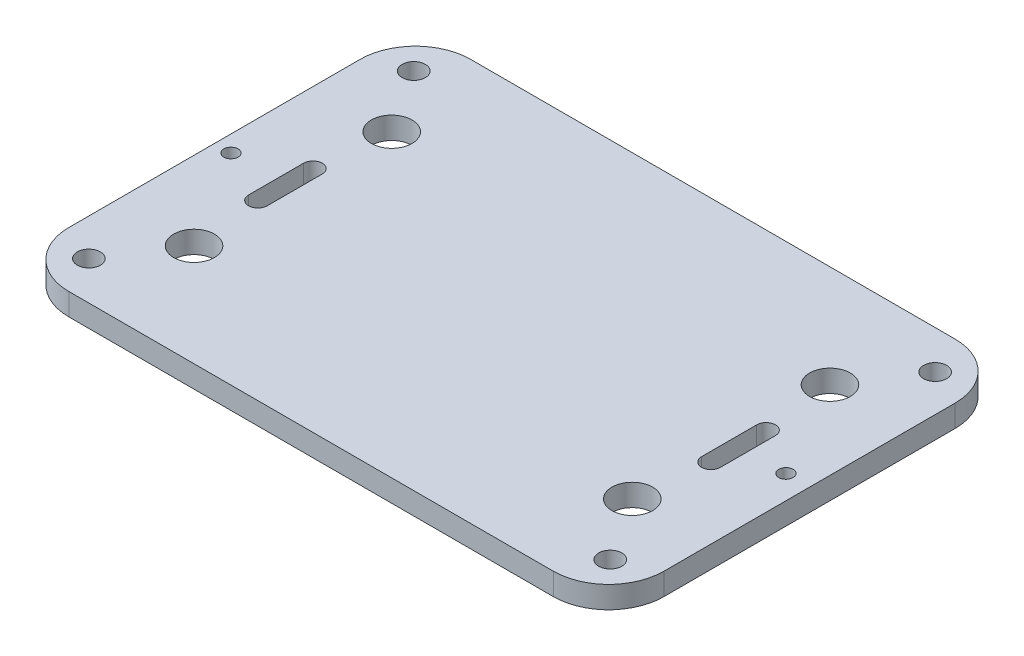
ISO-10303-21;
HEADER;
FILE_DESCRIPTION(('STEP AP214'),'2;1');
FILE_NAME('part.step','',(''),(''),'','','');
FILE_SCHEMA(('AUTOMOTIVE_DESIGN { 1 0 10303 214 1 1 1 1 }'));
ENDSEC;
DATA;
#1=APPLICATION_CONTEXT('core data for automotive mechanical design processes');
#2=APPLICATION_PROTOCOL_DEFINITION('international standard','automotive_design',2000,#1);
#3=PRODUCT_CONTEXT('',#1,'mechanical');
#4=PRODUCT('Part','Part','',(#3));
#5=PRODUCT_RELATED_PRODUCT_CATEGORY('part','',(#4));
#6=PRODUCT_DEFINITION_FORMATION('','',#4);
#7=PRODUCT_DEFINITION_CONTEXT('part definition',#1,'design');
#8=PRODUCT_DEFINITION('design','',#6,#7);
#9=PRODUCT_DEFINITION_SHAPE('','',#8);
#10=(LENGTH_UNIT() NAMED_UNIT(*) SI_UNIT(.MILLI.,.METRE.));
#11=(NAMED_UNIT(*) PLANE_ANGLE_UNIT() SI_UNIT($,.RADIAN.));
#12=(NAMED_UNIT(*) SI_UNIT($,.STERADIAN.) SOLID_ANGLE_UNIT());
#13=UNCERTAINTY_MEASURE_WITH_UNIT(LENGTH_MEASURE(1.E-05),#10,'distance_accuracy_value','');
#14=(GEOMETRIC_REPRESENTATION_CONTEXT(3) GLOBAL_UNCERTAINTY_ASSIGNED_CONTEXT((#13)) GLOBAL_UNIT_ASSIGNED_CONTEXT((#10,
#11,#12)) REPRESENTATION_CONTEXT('',''));
#15=CARTESIAN_POINT('',(0.,0.,0.));
#16=DIRECTION('',(0.,0.,1.));
#17=DIRECTION('',(1.,0.,0.));
#18=AXIS2_PLACEMENT_3D('',#15,#16,#17);
#19=CARTESIAN_POINT('',(-98.05,4.,-10.05));
#20=DIRECTION('',(0.,-1.,0.));
#21=DIRECTION('',(0.,0.,-1.));
#22=AXIS2_PLACEMENT_3D('',#19,#20,#21);
#23=PLANE('',#22);
#24=CARTESIAN_POINT('',(-95.2,4.,-31.5));
#25=DIRECTION('',(0.,1.,0.));
#26=DIRECTION('',(0.,0.,1.));
#27=AXIS2_PLACEMENT_3D('',#24,#25,#26);
#28=CIRCLE('',#27,1.69999999999999);
#29=CARTESIAN_POINT('',(-96.9,4.,-31.5));
#30=VERTEX_POINT('',#29);
#31=CARTESIAN_POINT('',(-93.5,4.,-31.5));
#32=VERTEX_POINT('',#31);
#33=EDGE_CURVE('E208',#30,#32,#28,.T.);
#34=ORIENTED_EDGE('',*,*,#33,.F.);
#35=DIRECTION('',(0.,0.,1.));
#36=VECTOR('',#35,1.);
#37=CARTESIAN_POINT('',(-96.9,4.,-31.5));
#38=LINE('',#37,#36);
#39=CARTESIAN_POINT('',(-96.9,4.,-41.5));
#40=VERTEX_POINT('',#39);
#41=EDGE_CURVE('E219',#40,#30,#38,.T.);
#42=ORIENTED_EDGE('',*,*,#41,.F.);
#43=CARTESIAN_POINT('',(-95.2,4.,-41.5));
#44=DIRECTION('',(0.,1.,0.));
#45=DIRECTION('',(0.,0.,1.));
#46=AXIS2_PLACEMENT_3D('',#43,#44,#45);
#47=CIRCLE('',#46,1.69999999999999);
#48=CARTESIAN_POINT('',(-93.5,4.,-41.5));
#49=VERTEX_POINT('',#48);
#50=EDGE_CURVE('E215',#49,#40,#47,.T.);
#51=ORIENTED_EDGE('',*,*,#50,.F.);
#52=DIRECTION('',(0.,0.,-1.));
#53=VECTOR('',#52,1.);
#54=CARTESIAN_POINT('',(-93.5,4.,-31.5));
#55=LINE('',#54,#53);
#56=EDGE_CURVE('E211',#32,#49,#55,.T.);
#57=ORIENTED_EDGE('',*,*,#56,.F.);
#58=EDGE_LOOP('',(#34,#42,#51,#57));
#59=FACE_BOUND('',#58,.T.);
#60=CARTESIAN_POINT('',(-98.05,4.,-10.05));
#61=DIRECTION('',(0.,1.,0.));
#62=DIRECTION('',(0.,0.,-1.));
#63=AXIS2_PLACEMENT_3D('',#60,#61,#62);
#64=CIRCLE('',#63,10.05);
#65=CARTESIAN_POINT('',(-108.1,4.,-10.0500000000001));
#66=VERTEX_POINT('',#65);
#67=CARTESIAN_POINT('',(-98.0499999999999,4.,0.));
#68=VERTEX_POINT('',#67);
#69=EDGE_CURVE('E315',#66,#68,#64,.T.);
#70=ORIENTED_EDGE('',*,*,#69,.T.);
#71=DIRECTION('',(1.,0.,0.));
#72=VECTOR('',#71,1.);
#73=CARTESIAN_POINT('',(-10.0500000000001,4.,0.));
#74=LINE('',#73,#72);
#75=CARTESIAN_POINT('',(-10.0500000000001,4.,0.));
#76=VERTEX_POINT('',#75);
#77=EDGE_CURVE('E319',#68,#76,#74,.T.);
#78=ORIENTED_EDGE('',*,*,#77,.T.);
#79=CARTESIAN_POINT('',(-10.05,4.,-10.05));
#80=DIRECTION('',(0.,1.,0.));
#81=DIRECTION('',(0.,0.,-1.));
#82=AXIS2_PLACEMENT_3D('',#79,#80,#81);
#83=CIRCLE('',#82,10.05);
#84=CARTESIAN_POINT('',(0.,4.,-10.0500000000001));
#85=VERTEX_POINT('',#84);
#86=EDGE_CURVE('E323',#76,#85,#83,.T.);
#87=ORIENTED_EDGE('',*,*,#86,.T.);
#88=DIRECTION('',(0.,0.,-1.));
#89=VECTOR('',#88,1.);
#90=CARTESIAN_POINT('',(0.,4.,-10.0500000000001));
#91=LINE('',#90,#89);
#92=CARTESIAN_POINT('',(0.,4.,-62.9499999999999));
#93=VERTEX_POINT('',#92);
#94=EDGE_CURVE('E326',#85,#93,#91,.T.);
#95=ORIENTED_EDGE('',*,*,#94,.T.);
#96=CARTESIAN_POINT('',(-10.05,4.,-62.95));
#97=DIRECTION('',(0.,1.,0.));
#98=DIRECTION('',(0.,0.,1.));
#99=AXIS2_PLACEMENT_3D('',#96,#97,#98);
#100=CIRCLE('',#99,10.05);
#101=CARTESIAN_POINT('',(-10.0500000000001,4.,-73.));
#102=VERTEX_POINT('',#101);
#103=EDGE_CURVE('E329',#93,#102,#100,.T.);
#104=ORIENTED_EDGE('',*,*,#103,.T.);
#105=DIRECTION('',(-1.,0.,0.));
#106=VECTOR('',#105,1.);
#107=CARTESIAN_POINT('',(-10.0500000000001,4.,-73.));
#108=LINE('',#107,#106);
#109=CARTESIAN_POINT('',(-98.0499999999999,4.,-73.));
#110=VERTEX_POINT('',#109);
#111=EDGE_CURVE('E332',#102,#110,#108,.T.);
#112=ORIENTED_EDGE('',*,*,#111,.T.);
#113=CARTESIAN_POINT('',(-98.05,4.,-62.95));
#114=DIRECTION('',(0.,1.,0.));
#115=DIRECTION('',(0.,0.,1.));
#116=AXIS2_PLACEMENT_3D('',#113,#114,#115);
#117=CIRCLE('',#116,10.05);
#118=CARTESIAN_POINT('',(-108.1,4.,-62.9499999999999));
#119=VERTEX_POINT('',#118);
#120=EDGE_CURVE('E335',#110,#119,#117,.T.);
#121=ORIENTED_EDGE('',*,*,#120,.T.);
#122=DIRECTION('',(0.,0.,1.));
#123=VECTOR('',#122,1.);
#124=CARTESIAN_POINT('',(-108.1,4.,-10.0500000000001));
#125=LINE('',#124,#123);
#126=EDGE_CURVE('E338',#119,#66,#125,.T.);
#127=ORIENTED_EDGE('',*,*,#126,.T.);
#128=EDGE_LOOP('',(#70,#78,#87,#95,#104,#112,#121,#127));
#129=FACE_BOUND('',#128,.T.);
#130=CARTESIAN_POINT('',(-6.7,4.,-66.));
#131=DIRECTION('',(0.,1.,0.));
#132=DIRECTION('',(0.,0.,1.));
#133=AXIS2_PLACEMENT_3D('',#130,#131,#132);
#134=CIRCLE('',#133,2.1);
#135=CARTESIAN_POINT('',(-6.7,4.,-63.9));
#136=VERTEX_POINT('',#135);
#137=EDGE_CURVE('E307',#136,#136,#134,.T.);
#138=ORIENTED_EDGE('',*,*,#137,.F.);
#139=EDGE_LOOP('',(#138));
#140=FACE_BOUND('',#139,.T.);
#141=CARTESIAN_POINT('',(-6.7,4.,-7.));
#142=DIRECTION('',(0.,1.,0.));
#143=DIRECTION('',(0.,0.,1.));
#144=AXIS2_PLACEMENT_3D('',#141,#142,#143);
#145=CIRCLE('',#144,2.1);
#146=CARTESIAN_POINT('',(-6.7,4.,-4.9));
#147=VERTEX_POINT('',#146);
#148=EDGE_CURVE('E299',#147,#147,#145,.T.);
#149=ORIENTED_EDGE('',*,*,#148,.F.);
#150=EDGE_LOOP('',(#149));
#151=FACE_BOUND('',#150,.T.);
#152=CARTESIAN_POINT('',(-101.4,4.,-66.));
#153=DIRECTION('',(0.,1.,0.));
#154=DIRECTION('',(0.,0.,1.));
#155=AXIS2_PLACEMENT_3D('',#152,#153,#154);
#156=CIRCLE('',#155,2.1);
#157=CARTESIAN_POINT('',(-101.4,4.,-63.9));
#158=VERTEX_POINT('',#157);
#159=EDGE_CURVE('E291',#158,#158,#156,.T.);
#160=ORIENTED_EDGE('',*,*,#159,.F.);
#161=EDGE_LOOP('',(#160));
#162=FACE_BOUND('',#161,.T.);
#163=CARTESIAN_POINT('',(-101.4,4.,-7.));
#164=DIRECTION('',(0.,1.,0.));
#165=DIRECTION('',(0.,0.,1.));
#166=AXIS2_PLACEMENT_3D('',#163,#164,#165);
#167=CIRCLE('',#166,2.1);
#168=CARTESIAN_POINT('',(-101.4,4.,-4.9));
#169=VERTEX_POINT('',#168);
#170=EDGE_CURVE('E283',#169,#169,#167,.T.);
#171=ORIENTED_EDGE('',*,*,#170,.F.);
#172=EDGE_LOOP('',(#171));
#173=FACE_BOUND('',#172,.T.);
#174=CARTESIAN_POINT('',(-93.85,4.,-54.45));
#175=DIRECTION('',(0.,1.,0.));
#176=DIRECTION('',(0.,0.,1.));
#177=AXIS2_PLACEMENT_3D('',#174,#175,#176);
#178=CIRCLE('',#177,3.7);
#179=CARTESIAN_POINT('',(-93.85,4.,-50.75));
#180=VERTEX_POINT('',#179);
#181=EDGE_CURVE('E275',#180,#180,#178,.T.);
#182=ORIENTED_EDGE('',*,*,#181,.F.);
#183=EDGE_LOOP('',(#182));
#184=FACE_BOUND('',#183,.T.);
#185=CARTESIAN_POINT('',(-93.85,4.,-18.55));
#186=DIRECTION('',(0.,1.,0.));
#187=DIRECTION('',(0.,0.,1.));
#188=AXIS2_PLACEMENT_3D('',#185,#186,#187);
#189=CIRCLE('',#188,3.69999999999999);
#190=CARTESIAN_POINT('',(-93.85,4.,-14.85));
#191=VERTEX_POINT('',#190);
#192=EDGE_CURVE('E267',#191,#191,#189,.T.);
#193=ORIENTED_EDGE('',*,*,#192,.F.);
#194=EDGE_LOOP('',(#193));
#195=FACE_BOUND('',#194,.T.);
#196=CARTESIAN_POINT('',(-14.25,4.,-18.55));
#197=DIRECTION('',(0.,1.,0.));
#198=DIRECTION('',(0.,0.,1.));
#199=AXIS2_PLACEMENT_3D('',#196,#197,#198);
#200=CIRCLE('',#199,3.7);
#201=CARTESIAN_POINT('',(-14.25,4.,-14.85));
#202=VERTEX_POINT('',#201);
#203=EDGE_CURVE('E259',#202,#202,#200,.T.);
#204=ORIENTED_EDGE('',*,*,#203,.F.);
#205=EDGE_LOOP('',(#204));
#206=FACE_BOUND('',#205,.T.);
#207=CARTESIAN_POINT('',(-14.25,4.,-54.45));
#208=DIRECTION('',(0.,1.,0.));
#209=DIRECTION('',(0.,0.,1.));
#210=AXIS2_PLACEMENT_3D('',#207,#208,#209);
#211=CIRCLE('',#210,3.7);
#212=CARTESIAN_POINT('',(-14.25,4.,-50.75));
#213=VERTEX_POINT('',#212);
#214=EDGE_CURVE('E251',#213,#213,#211,.T.);
#215=ORIENTED_EDGE('',*,*,#214,.F.);
#216=EDGE_LOOP('',(#215));
#217=FACE_BOUND('',#216,.T.);
#218=CARTESIAN_POINT('',(-12.9,4.,-31.5));
#219=DIRECTION('',(0.,1.,0.));
#220=DIRECTION('',(0.,0.,1.));
#221=AXIS2_PLACEMENT_3D('',#218,#219,#220);
#222=CIRCLE('',#221,1.70000000000001);
#223=CARTESIAN_POINT('',(-14.6,4.,-31.5));
#224=VERTEX_POINT('',#223);
#225=CARTESIAN_POINT('',(-11.2,4.,-31.5));
#226=VERTEX_POINT('',#225);
#227=EDGE_CURVE('E157',#224,#226,#222,.T.);
#228=ORIENTED_EDGE('',*,*,#227,.F.);
#229=DIRECTION('',(0.,0.,1.));
#230=VECTOR('',#229,1.);
#231=CARTESIAN_POINT('',(-14.6,4.,-31.5));
#232=LINE('',#231,#230);
#233=CARTESIAN_POINT('',(-14.6,4.,-41.5));
#234=VERTEX_POINT('',#233);
#235=EDGE_CURVE('E184',#234,#224,#232,.T.);
#236=ORIENTED_EDGE('',*,*,#235,.F.);
#237=CARTESIAN_POINT('',(-12.9,4.,-41.5));
#238=DIRECTION('',(0.,1.,0.));
#239=DIRECTION('',(0.,0.,1.));
#240=AXIS2_PLACEMENT_3D('',#237,#238,#239);
#241=CIRCLE('',#240,1.70000000000001);
#242=CARTESIAN_POINT('',(-11.2,4.,-41.5));
#243=VERTEX_POINT('',#242);
#244=EDGE_CURVE('E180',#243,#234,#241,.T.);
#245=ORIENTED_EDGE('',*,*,#244,.F.);
#246=DIRECTION('',(0.,0.,-1.));
#247=VECTOR('',#246,1.);
#248=CARTESIAN_POINT('',(-11.2,4.,-31.5));
#249=LINE('',#248,#247);
#250=EDGE_CURVE('E166',#226,#243,#249,.T.);
#251=ORIENTED_EDGE('',*,*,#250,.F.);
#252=EDGE_LOOP('',(#228,#236,#245,#251));
#253=FACE_BOUND('',#252,.T.);
#254=CARTESIAN_POINT('',(-4.3,4.,-36.5));
#255=DIRECTION('',(0.,1.,0.));
#256=DIRECTION('',(0.,0.,1.));
#257=AXIS2_PLACEMENT_3D('',#254,#255,#256);
#258=CIRCLE('',#257,1.3);
#259=CARTESIAN_POINT('',(-4.3,4.,-35.2));
#260=VERTEX_POINT('',#259);
#261=EDGE_CURVE('E192',#260,#260,#258,.T.);
#262=ORIENTED_EDGE('',*,*,#261,.F.);
#263=EDGE_LOOP('',(#262));
#264=FACE_BOUND('',#263,.T.);
#265=CARTESIAN_POINT('',(-105.1,4.,-36.5));
#266=DIRECTION('',(0.,1.,0.));
#267=DIRECTION('',(0.,0.,1.));
#268=AXIS2_PLACEMENT_3D('',#265,#266,#267);
#269=CIRCLE('',#268,1.29999999999999);
#270=CARTESIAN_POINT('',(-105.1,4.,-35.2));
#271=VERTEX_POINT('',#270);
#272=EDGE_CURVE('E499',#271,#271,#269,.T.);
#273=ORIENTED_EDGE('',*,*,#272,.F.);
#274=EDGE_LOOP('',(#273));
#275=FACE_BOUND('',#274,.T.);
#276=ADVANCED_FACE('F43',(#59,#129,#140,#151,#162,#173,#184,#195,#206,#217,#253,#264,#275),#23,.F.);
#277=CARTESIAN_POINT('',(-98.05,0.,-10.05));
#278=DIRECTION('',(0.,-1.,0.));
#279=DIRECTION('',(0.,0.,-1.));
#280=AXIS2_PLACEMENT_3D('',#277,#278,#279);
#281=PLANE('',#280);
#282=CARTESIAN_POINT('',(-4.3,0.,-36.5));
#283=DIRECTION('',(0.,1.,0.));
#284=DIRECTION('',(0.,0.,1.));
#285=AXIS2_PLACEMENT_3D('',#282,#283,#284);
#286=CIRCLE('',#285,1.3);
#287=CARTESIAN_POINT('',(-4.3,0.,-35.2));
#288=VERTEX_POINT('',#287);
#289=EDGE_CURVE('E503',#288,#288,#286,.T.);
#290=ORIENTED_EDGE('',*,*,#289,.T.);
#291=EDGE_LOOP('',(#290));
#292=FACE_BOUND('',#291,.T.);
#293=CARTESIAN_POINT('',(-14.25,0.,-18.55));
#294=DIRECTION('',(0.,1.,0.));
#295=DIRECTION('',(0.,0.,1.));
#296=AXIS2_PLACEMENT_3D('',#293,#294,#295);
#297=CIRCLE('',#296,3.7);
#298=CARTESIAN_POINT('',(-14.25,0.,-14.85));
#299=VERTEX_POINT('',#298);
#300=EDGE_CURVE('E255',#299,#299,#297,.T.);
#301=ORIENTED_EDGE('',*,*,#300,.T.);
#302=EDGE_LOOP('',(#301));
#303=FACE_BOUND('',#302,.T.);
#304=CARTESIAN_POINT('',(-93.85,0.,-54.45));
#305=DIRECTION('',(0.,1.,0.));
#306=DIRECTION('',(0.,0.,1.));
#307=AXIS2_PLACEMENT_3D('',#304,#305,#306);
#308=CIRCLE('',#307,3.7);
#309=CARTESIAN_POINT('',(-93.85,0.,-50.75));
#310=VERTEX_POINT('',#309);
#311=EDGE_CURVE('E271',#310,#310,#308,.T.);
#312=ORIENTED_EDGE('',*,*,#311,.T.);
#313=EDGE_LOOP('',(#312));
#314=FACE_BOUND('',#313,.T.);
#315=CARTESIAN_POINT('',(-101.4,0.,-66.));
#316=DIRECTION('',(0.,1.,0.));
#317=DIRECTION('',(0.,0.,1.));
#318=AXIS2_PLACEMENT_3D('',#315,#316,#317);
#319=CIRCLE('',#318,2.1);
#320=CARTESIAN_POINT('',(-101.4,0.,-63.9));
#321=VERTEX_POINT('',#320);
#322=EDGE_CURVE('E287',#321,#321,#319,.T.);
#323=ORIENTED_EDGE('',*,*,#322,.T.);
#324=EDGE_LOOP('',(#323));
#325=FACE_BOUND('',#324,.T.);
#326=CARTESIAN_POINT('',(-6.7,0.,-66.));
#327=DIRECTION('',(0.,1.,0.));
#328=DIRECTION('',(0.,0.,1.));
#329=AXIS2_PLACEMENT_3D('',#326,#327,#328);
#330=CIRCLE('',#329,2.1);
#331=CARTESIAN_POINT('',(-6.7,0.,-63.9));
#332=VERTEX_POINT('',#331);
#333=EDGE_CURVE('E303',#332,#332,#330,.T.);
#334=ORIENTED_EDGE('',*,*,#333,.T.);
#335=EDGE_LOOP('',(#334));
#336=FACE_BOUND('',#335,.T.);
#337=CARTESIAN_POINT('',(-98.05,0.,-10.05));
#338=DIRECTION('',(0.,1.,0.));
#339=DIRECTION('',(0.,0.,-1.));
#340=AXIS2_PLACEMENT_3D('',#337,#338,#339);
#341=CIRCLE('',#340,10.05);
#342=CARTESIAN_POINT('',(-108.1,0.,-10.0500000000001));
#343=VERTEX_POINT('',#342);
#344=CARTESIAN_POINT('',(-98.0499999999999,0.,0.));
#345=VERTEX_POINT('',#344);
#346=EDGE_CURVE('E311',#343,#345,#341,.T.);
#347=ORIENTED_EDGE('',*,*,#346,.F.);
#348=DIRECTION('',(0.,0.,1.));
#349=VECTOR('',#348,1.);
#350=CARTESIAN_POINT('',(-108.1,0.,-10.0500000000001));
#351=LINE('',#350,#349);
#352=CARTESIAN_POINT('',(-108.1,0.,-62.9499999999999));
#353=VERTEX_POINT('',#352);
#354=EDGE_CURVE('E320',#353,#343,#351,.T.);
#355=ORIENTED_EDGE('',*,*,#354,.F.);
#356=CARTESIAN_POINT('',(-98.05,0.,-62.95));
#357=DIRECTION('',(0.,1.,0.));
#358=DIRECTION('',(0.,0.,1.));
#359=AXIS2_PLACEMENT_3D('',#356,#357,#358);
#360=CIRCLE('',#359,10.05);
#361=CARTESIAN_POINT('',(-98.0499999999999,0.,-73.));
#362=VERTEX_POINT('',#361);
#363=EDGE_CURVE('E360',#362,#353,#360,.T.);
#364=ORIENTED_EDGE('',*,*,#363,.F.);
#365=DIRECTION('',(-1.,0.,0.));
#366=VECTOR('',#365,1.);
#367=CARTESIAN_POINT('',(-10.0500000000001,0.,-73.));
#368=LINE('',#367,#366);
#369=CARTESIAN_POINT('',(-10.0500000000001,0.,-73.));
#370=VERTEX_POINT('',#369);
#371=EDGE_CURVE('E357',#370,#362,#368,.T.);
#372=ORIENTED_EDGE('',*,*,#371,.F.);
#373=CARTESIAN_POINT('',(-10.05,0.,-62.95));
#374=DIRECTION('',(0.,1.,0.));
#375=DIRECTION('',(0.,0.,1.));
#376=AXIS2_PLACEMENT_3D('',#373,#374,#375);
#377=CIRCLE('',#376,10.05);
#378=CARTESIAN_POINT('',(0.,0.,-62.9499999999999));
#379=VERTEX_POINT('',#378);
#380=EDGE_CURVE('E354',#379,#370,#377,.T.);
#381=ORIENTED_EDGE('',*,*,#380,.F.);
#382=DIRECTION('',(0.,0.,-1.));
#383=VECTOR('',#382,1.);
#384=CARTESIAN_POINT('',(0.,0.,-10.0500000000001));
#385=LINE('',#384,#383);
#386=CARTESIAN_POINT('',(0.,0.,-10.0500000000001));
#387=VERTEX_POINT('',#386);
#388=EDGE_CURVE('E351',#387,#379,#385,.T.);
#389=ORIENTED_EDGE('',*,*,#388,.F.);
#390=CARTESIAN_POINT('',(-10.05,0.,-10.05));
#391=DIRECTION('',(0.,1.,0.));
#392=DIRECTION('',(0.,0.,-1.));
#393=AXIS2_PLACEMENT_3D('',#390,#391,#392);
#394=CIRCLE('',#393,10.05);
#395=CARTESIAN_POINT('',(-10.0500000000001,0.,0.));
#396=VERTEX_POINT('',#395);
#397=EDGE_CURVE('E348',#396,#387,#394,.T.);
#398=ORIENTED_EDGE('',*,*,#397,.F.);
#399=DIRECTION('',(1.,0.,0.));
#400=VECTOR('',#399,1.);
#401=CARTESIAN_POINT('',(-10.0500000000001,0.,0.));
#402=LINE('',#401,#400);
#403=EDGE_CURVE('E345',#345,#396,#402,.T.);
#404=ORIENTED_EDGE('',*,*,#403,.F.);
#405=EDGE_LOOP('',(#347,#355,#364,#372,#381,#389,#398,#404));
#406=FACE_BOUND('',#405,.T.);
#407=CARTESIAN_POINT('',(-6.7,0.,-7.));
#408=DIRECTION('',(0.,1.,0.));
#409=DIRECTION('',(0.,0.,1.));
#410=AXIS2_PLACEMENT_3D('',#407,#408,#409);
#411=CIRCLE('',#410,2.1);
#412=CARTESIAN_POINT('',(-6.7,0.,-4.9));
#413=VERTEX_POINT('',#412);
#414=EDGE_CURVE('E295',#413,#413,#411,.T.);
#415=ORIENTED_EDGE('',*,*,#414,.T.);
#416=EDGE_LOOP('',(#415));
#417=FACE_BOUND('',#416,.T.);
#418=CARTESIAN_POINT('',(-101.4,0.,-7.));
#419=DIRECTION('',(0.,1.,0.));
#420=DIRECTION('',(0.,0.,1.));
#421=AXIS2_PLACEMENT_3D('',#418,#419,#420);
#422=CIRCLE('',#421,2.1);
#423=CARTESIAN_POINT('',(-101.4,0.,-4.9));
#424=VERTEX_POINT('',#423);
#425=EDGE_CURVE('E279',#424,#424,#422,.T.);
#426=ORIENTED_EDGE('',*,*,#425,.T.);
#427=EDGE_LOOP('',(#426));
#428=FACE_BOUND('',#427,.T.);
#429=CARTESIAN_POINT('',(-93.85,0.,-18.55));
#430=DIRECTION('',(0.,1.,0.));
#431=DIRECTION('',(0.,0.,1.));
#432=AXIS2_PLACEMENT_3D('',#429,#430,#431);
#433=CIRCLE('',#432,3.69999999999999);
#434=CARTESIAN_POINT('',(-93.85,0.,-14.85));
#435=VERTEX_POINT('',#434);
#436=EDGE_CURVE('E263',#435,#435,#433,.T.);
#437=ORIENTED_EDGE('',*,*,#436,.T.);
#438=EDGE_LOOP('',(#437));
#439=FACE_BOUND('',#438,.T.);
#440=CARTESIAN_POINT('',(-14.25,0.,-54.45));
#441=DIRECTION('',(0.,1.,0.));
#442=DIRECTION('',(0.,0.,1.));
#443=AXIS2_PLACEMENT_3D('',#440,#441,#442);
#444=CIRCLE('',#443,3.7);
#445=CARTESIAN_POINT('',(-14.25,0.,-50.75));
#446=VERTEX_POINT('',#445);
#447=EDGE_CURVE('E250',#446,#446,#444,.T.);
#448=ORIENTED_EDGE('',*,*,#447,.T.);
#449=EDGE_LOOP('',(#448));
#450=FACE_BOUND('',#449,.T.);
#451=DIRECTION('',(0.,0.,1.));
#452=VECTOR('',#451,1.);
#453=CARTESIAN_POINT('',(-96.9,0.,-31.5));
#454=LINE('',#453,#452);
#455=CARTESIAN_POINT('',(-96.9,0.,-41.5));
#456=VERTEX_POINT('',#455);
#457=CARTESIAN_POINT('',(-96.9,0.,-31.5));
#458=VERTEX_POINT('',#457);
#459=EDGE_CURVE('E212',#456,#458,#454,.T.);
#460=ORIENTED_EDGE('',*,*,#459,.T.);
#461=CARTESIAN_POINT('',(-95.2,0.,-31.5));
#462=DIRECTION('',(0.,1.,0.));
#463=DIRECTION('',(0.,0.,1.));
#464=AXIS2_PLACEMENT_3D('',#461,#462,#463);
#465=CIRCLE('',#464,1.69999999999999);
#466=CARTESIAN_POINT('',(-93.5,0.,-31.5));
#467=VERTEX_POINT('',#466);
#468=EDGE_CURVE('E175',#458,#467,#465,.T.);
#469=ORIENTED_EDGE('',*,*,#468,.T.);
#470=DIRECTION('',(0.,0.,-1.));
#471=VECTOR('',#470,1.);
#472=CARTESIAN_POINT('',(-93.5,0.,-31.5));
#473=LINE('',#472,#471);
#474=CARTESIAN_POINT('',(-93.5,0.,-41.5));
#475=VERTEX_POINT('',#474);
#476=EDGE_CURVE('E226',#467,#475,#473,.T.);
#477=ORIENTED_EDGE('',*,*,#476,.T.);
#478=CARTESIAN_POINT('',(-95.2,0.,-41.5));
#479=DIRECTION('',(0.,1.,0.));
#480=DIRECTION('',(0.,0.,1.));
#481=AXIS2_PLACEMENT_3D('',#478,#479,#480);
#482=CIRCLE('',#481,1.69999999999999);
#483=EDGE_CURVE('E230',#475,#456,#482,.T.);
#484=ORIENTED_EDGE('',*,*,#483,.T.);
#485=EDGE_LOOP('',(#460,#469,#477,#484));
#486=FACE_BOUND('',#485,.T.);
#487=DIRECTION('',(0.,0.,1.));
#488=VECTOR('',#487,1.);
#489=CARTESIAN_POINT('',(-14.6,0.,-31.5));
#490=LINE('',#489,#488);
#491=CARTESIAN_POINT('',(-14.6,0.,-41.5));
#492=VERTEX_POINT('',#491);
#493=CARTESIAN_POINT('',(-14.6,0.,-31.5));
#494=VERTEX_POINT('',#493);
#495=EDGE_CURVE('E167',#492,#494,#490,.T.);
#496=ORIENTED_EDGE('',*,*,#495,.T.);
#497=CARTESIAN_POINT('',(-12.9,0.,-31.5));
#498=DIRECTION('',(0.,1.,0.));
#499=DIRECTION('',(0.,0.,1.));
#500=AXIS2_PLACEMENT_3D('',#497,#498,#499);
#501=CIRCLE('',#500,1.70000000000001);
#502=CARTESIAN_POINT('',(-11.2,0.,-31.5));
#503=VERTEX_POINT('',#502);
#504=EDGE_CURVE('E67',#494,#503,#501,.T.);
#505=ORIENTED_EDGE('',*,*,#504,.T.);
#506=DIRECTION('',(0.,0.,-1.));
#507=VECTOR('',#506,1.);
#508=CARTESIAN_POINT('',(-11.2,0.,-31.5));
#509=LINE('',#508,#507);
#510=CARTESIAN_POINT('',(-11.2,0.,-41.5));
#511=VERTEX_POINT('',#510);
#512=EDGE_CURVE('E173',#503,#511,#509,.T.);
#513=ORIENTED_EDGE('',*,*,#512,.T.);
#514=CARTESIAN_POINT('',(-12.9,0.,-41.5));
#515=DIRECTION('',(0.,1.,0.));
#516=DIRECTION('',(0.,0.,1.));
#517=AXIS2_PLACEMENT_3D('',#514,#515,#516);
#518=CIRCLE('',#517,1.70000000000001);
#519=EDGE_CURVE('E195',#511,#492,#518,.T.);
#520=ORIENTED_EDGE('',*,*,#519,.T.);
#521=EDGE_LOOP('',(#496,#505,#513,#520));
#522=FACE_BOUND('',#521,.T.);
#523=CARTESIAN_POINT('',(-105.1,0.,-36.5));
#524=DIRECTION('',(0.,1.,0.));
#525=DIRECTION('',(0.,0.,1.));
#526=AXIS2_PLACEMENT_3D('',#523,#524,#525);
#527=CIRCLE('',#526,1.29999999999999);
#528=CARTESIAN_POINT('',(-105.1,0.,-35.2));
#529=VERTEX_POINT('',#528);
#530=EDGE_CURVE('E496',#529,#529,#527,.T.);
#531=ORIENTED_EDGE('',*,*,#530,.T.);
#532=EDGE_LOOP('',(#531));
#533=FACE_BOUND('',#532,.T.);
#534=ADVANCED_FACE('F399',(#292,#303,#314,#325,#336,#406,#417,#428,#439,#450,#486,#522,#533),
#281,.T.);
#535=CARTESIAN_POINT('',(-98.05,4.,-10.05));
#536=DIRECTION('',(0.,-1.,0.));
#537=DIRECTION('',(0.,0.,-1.));
#538=AXIS2_PLACEMENT_3D('',#535,#536,#537);
#539=CYLINDRICAL_SURFACE('',#538,10.05);
#540=ORIENTED_EDGE('',*,*,#346,.T.);
#541=DIRECTION('',(0.,-1.,0.));
#542=VECTOR('',#541,1.);
#543=CARTESIAN_POINT('',(-98.0499999999999,4.,0.));
#544=LINE('',#543,#542);
#545=EDGE_CURVE('E11',#68,#345,#544,.T.);
#546=ORIENTED_EDGE('',*,*,#545,.F.);
#547=ORIENTED_EDGE('',*,*,#69,.F.);
#548=DIRECTION('',(0.,-1.,0.));
#549=VECTOR('',#548,1.);
#550=CARTESIAN_POINT('',(-108.1,4.,-10.0500000000001));
#551=LINE('',#550,#549);
#552=EDGE_CURVE('E341',#66,#343,#551,.T.);
#553=ORIENTED_EDGE('',*,*,#552,.T.);
#554=EDGE_LOOP('',(#540,#546,#547,#553));
#555=FACE_BOUND('',#554,.T.);
#556=ADVANCED_FACE('F45',(#555),#539,.T.);
#557=CARTESIAN_POINT('',(-10.0500000000001,4.,0.));
#558=DIRECTION('',(0.,0.,-1.));
#559=DIRECTION('',(-1.,0.,0.));
#560=AXIS2_PLACEMENT_3D('',#557,#558,#559);
#561=PLANE('',#560);
#562=ORIENTED_EDGE('',*,*,#403,.T.);
#563=DIRECTION('',(0.,-1.,0.));
#564=VECTOR('',#563,1.);
#565=CARTESIAN_POINT('',(-10.0500000000001,4.,0.));
#566=LINE('',#565,#564);
#567=EDGE_CURVE('E52',#76,#396,#566,.T.);
#568=ORIENTED_EDGE('',*,*,#567,.F.);
#569=ORIENTED_EDGE('',*,*,#77,.F.);
#570=ORIENTED_EDGE('',*,*,#545,.T.);
#571=EDGE_LOOP('',(#562,#568,#569,#570));
#572=FACE_BOUND('',#571,.T.);
#573=ADVANCED_FACE('F417',(#572),#561,.F.);
#574=CARTESIAN_POINT('',(-10.05,4.,-10.05));
#575=DIRECTION('',(0.,-1.,0.));
#576=DIRECTION('',(0.,0.,-1.));
#577=AXIS2_PLACEMENT_3D('',#574,#575,#576);
#578=CYLINDRICAL_SURFACE('',#577,10.05);
#579=ORIENTED_EDGE('',*,*,#397,.T.);
#580=DIRECTION('',(0.,-1.,0.));
#581=VECTOR('',#580,1.);
#582=CARTESIAN_POINT('',(0.,4.,-10.0500000000001));
#583=LINE('',#582,#581);
#584=EDGE_CURVE('E384',#85,#387,#583,.T.);
#585=ORIENTED_EDGE('',*,*,#584,.F.);
#586=ORIENTED_EDGE('',*,*,#86,.F.);
#587=ORIENTED_EDGE('',*,*,#567,.T.);
#588=EDGE_LOOP('',(#579,#585,#586,#587));
#589=FACE_BOUND('',#588,.T.);
#590=ADVANCED_FACE('F393',(#589),#578,.T.);
#591=CARTESIAN_POINT('',(0.,4.,-10.0500000000001));
#592=DIRECTION('',(-1.,0.,0.));
#593=DIRECTION('',(0.,0.,1.));
#594=AXIS2_PLACEMENT_3D('',#591,#592,#593);
#595=PLANE('',#594);
#596=ORIENTED_EDGE('',*,*,#388,.T.);
#597=DIRECTION('',(0.,-1.,0.));
#598=VECTOR('',#597,1.);
#599=CARTESIAN_POINT('',(0.,4.,-62.9499999999999));
#600=LINE('',#599,#598);
#601=EDGE_CURVE('E380',#93,#379,#600,.T.);
#602=ORIENTED_EDGE('',*,*,#601,.F.);
#603=ORIENTED_EDGE('',*,*,#94,.F.);
#604=ORIENTED_EDGE('',*,*,#584,.T.);
#605=EDGE_LOOP('',(#596,#602,#603,#604));
#606=FACE_BOUND('',#605,.T.);
#607=ADVANCED_FACE('F405',(#606),#595,.F.);
#608=CARTESIAN_POINT('',(-10.05,4.,-62.95));
#609=DIRECTION('',(0.,-1.,0.));
#610=DIRECTION('',(0.,0.,-1.));
#611=AXIS2_PLACEMENT_3D('',#608,#609,#610);
#612=CYLINDRICAL_SURFACE('',#611,10.05);
#613=ORIENTED_EDGE('',*,*,#380,.T.);
#614=DIRECTION('',(0.,-1.,0.));
#615=VECTOR('',#614,1.);
#616=CARTESIAN_POINT('',(-10.0500000000001,4.,-73.));
#617=LINE('',#616,#615);
#618=EDGE_CURVE('E376',#102,#370,#617,.T.);
#619=ORIENTED_EDGE('',*,*,#618,.F.);
#620=ORIENTED_EDGE('',*,*,#103,.F.);
#621=ORIENTED_EDGE('',*,*,#601,.T.);
#622=EDGE_LOOP('',(#613,#619,#620,#621));
#623=FACE_BOUND('',#622,.T.);
#624=ADVANCED_FACE('F409',(#623),#612,.T.);
#625=CARTESIAN_POINT('',(-10.0500000000001,4.,-73.));
#626=DIRECTION('',(0.,0.,1.));
#627=DIRECTION('',(1.,0.,0.));
#628=AXIS2_PLACEMENT_3D('',#625,#626,#627);
#629=PLANE('',#628);
#630=ORIENTED_EDGE('',*,*,#371,.T.);
#631=DIRECTION('',(0.,-1.,0.));
#632=VECTOR('',#631,1.);
#633=CARTESIAN_POINT('',(-98.0499999999999,4.,-73.));
#634=LINE('',#633,#632);
#635=EDGE_CURVE('E372',#110,#362,#634,.T.);
#636=ORIENTED_EDGE('',*,*,#635,.F.);
#637=ORIENTED_EDGE('',*,*,#111,.F.);
#638=ORIENTED_EDGE('',*,*,#618,.T.);
#639=EDGE_LOOP('',(#630,#636,#637,#638));
#640=FACE_BOUND('',#639,.T.);
#641=ADVANCED_FACE('F430',(#640),#629,.F.);
#642=CARTESIAN_POINT('',(-98.05,4.,-62.95));
#643=DIRECTION('',(0.,-1.,0.));
#644=DIRECTION('',(0.,0.,-1.));
#645=AXIS2_PLACEMENT_3D('',#642,#643,#644);
#646=CYLINDRICAL_SURFACE('',#645,10.05);
#647=ORIENTED_EDGE('',*,*,#363,.T.);
#648=DIRECTION('',(0.,-1.,0.));
#649=VECTOR('',#648,1.);
#650=CARTESIAN_POINT('',(-108.1,4.,-62.9499999999999));
#651=LINE('',#650,#649);
#652=EDGE_CURVE('E368',#119,#353,#651,.T.);
#653=ORIENTED_EDGE('',*,*,#652,.F.);
#654=ORIENTED_EDGE('',*,*,#120,.F.);
#655=ORIENTED_EDGE('',*,*,#635,.T.);
#656=EDGE_LOOP('',(#647,#653,#654,#655));
#657=FACE_BOUND('',#656,.T.);
#658=ADVANCED_FACE('F428',(#657),#646,.T.);
#659=CARTESIAN_POINT('',(-108.1,4.,-10.0500000000001));
#660=DIRECTION('',(1.,0.,0.));
#661=DIRECTION('',(0.,0.,-1.));
#662=AXIS2_PLACEMENT_3D('',#659,#660,#661);
#663=PLANE('',#662);
#664=ORIENTED_EDGE('',*,*,#354,.T.);
#665=ORIENTED_EDGE('',*,*,#552,.F.);
#666=ORIENTED_EDGE('',*,*,#126,.F.);
#667=ORIENTED_EDGE('',*,*,#652,.T.);
#668=EDGE_LOOP('',(#664,#665,#666,#667));
#669=FACE_BOUND('',#668,.T.);
#670=ADVANCED_FACE('F423',(#669),#663,.F.);
#671=CARTESIAN_POINT('',(-6.7,4.,-66.));
#672=DIRECTION('',(0.,-1.,0.));
#673=DIRECTION('',(0.,0.,-1.));
#674=AXIS2_PLACEMENT_3D('',#671,#672,#673);
#675=CYLINDRICAL_SURFACE('',#674,2.1);
#676=ORIENTED_EDGE('',*,*,#137,.T.);
#677=EDGE_LOOP('',(#676));
#678=FACE_BOUND('',#677,.T.);
#679=ORIENTED_EDGE('',*,*,#333,.F.);
#680=EDGE_LOOP('',(#679));
#681=FACE_BOUND('',#680,.T.);
#682=ADVANCED_FACE('F449',(#678,#681),#675,.F.);
#683=CARTESIAN_POINT('',(-6.7,4.,-7.));
#684=DIRECTION('',(0.,-1.,0.));
#685=DIRECTION('',(0.,0.,-1.));
#686=AXIS2_PLACEMENT_3D('',#683,#684,#685);
#687=CYLINDRICAL_SURFACE('',#686,2.1);
#688=ORIENTED_EDGE('',*,*,#148,.T.);
#689=EDGE_LOOP('',(#688));
#690=FACE_BOUND('',#689,.T.);
#691=ORIENTED_EDGE('',*,*,#414,.F.);
#692=EDGE_LOOP('',(#691));
#693=FACE_BOUND('',#692,.T.);
#694=ADVANCED_FACE('F456',(#690,#693),#687,.F.);
#695=CARTESIAN_POINT('',(-101.4,4.,-66.));
#696=DIRECTION('',(0.,-1.,0.));
#697=DIRECTION('',(0.,0.,-1.));
#698=AXIS2_PLACEMENT_3D('',#695,#696,#697);
#699=CYLINDRICAL_SURFACE('',#698,2.1);
#700=ORIENTED_EDGE('',*,*,#159,.T.);
#701=EDGE_LOOP('',(#700));
#702=FACE_BOUND('',#701,.T.);
#703=ORIENTED_EDGE('',*,*,#322,.F.);
#704=EDGE_LOOP('',(#703));
#705=FACE_BOUND('',#704,.T.);
#706=ADVANCED_FACE('F461',(#702,#705),#699,.F.);
#707=CARTESIAN_POINT('',(-101.4,4.,-7.));
#708=DIRECTION('',(0.,-1.,0.));
#709=DIRECTION('',(0.,0.,-1.));
#710=AXIS2_PLACEMENT_3D('',#707,#708,#709);
#711=CYLINDRICAL_SURFACE('',#710,2.1);
#712=ORIENTED_EDGE('',*,*,#170,.T.);
#713=EDGE_LOOP('',(#712));
#714=FACE_BOUND('',#713,.T.);
#715=ORIENTED_EDGE('',*,*,#425,.F.);
#716=EDGE_LOOP('',(#715));
#717=FACE_BOUND('',#716,.T.);
#718=ADVANCED_FACE('F560',(#714,#717),#711,.F.);
#719=CARTESIAN_POINT('',(-93.85,4.,-54.45));
#720=DIRECTION('',(0.,-1.,0.));
#721=DIRECTION('',(0.,0.,-1.));
#722=AXIS2_PLACEMENT_3D('',#719,#720,#721);
#723=CYLINDRICAL_SURFACE('',#722,3.7);
#724=ORIENTED_EDGE('',*,*,#181,.T.);
#725=EDGE_LOOP('',(#724));
#726=FACE_BOUND('',#725,.T.);
#727=ORIENTED_EDGE('',*,*,#311,.F.);
#728=EDGE_LOOP('',(#727));
#729=FACE_BOUND('',#728,.T.);
#730=ADVANCED_FACE('F556',(#726,#729),#723,.F.);
#731=CARTESIAN_POINT('',(-93.85,4.,-18.55));
#732=DIRECTION('',(0.,-1.,0.));
#733=DIRECTION('',(0.,0.,-1.));
#734=AXIS2_PLACEMENT_3D('',#731,#732,#733);
#735=CYLINDRICAL_SURFACE('',#734,3.69999999999999);
#736=ORIENTED_EDGE('',*,*,#192,.T.);
#737=EDGE_LOOP('',(#736));
#738=FACE_BOUND('',#737,.T.);
#739=ORIENTED_EDGE('',*,*,#436,.F.);
#740=EDGE_LOOP('',(#739));
#741=FACE_BOUND('',#740,.T.);
#742=ADVANCED_FACE('F552',(#738,#741),#735,.F.);
#743=CARTESIAN_POINT('',(-14.25,4.,-18.55));
#744=DIRECTION('',(0.,-1.,0.));
#745=DIRECTION('',(0.,0.,-1.));
#746=AXIS2_PLACEMENT_3D('',#743,#744,#745);
#747=CYLINDRICAL_SURFACE('',#746,3.7);
#748=ORIENTED_EDGE('',*,*,#203,.T.);
#749=EDGE_LOOP('',(#748));
#750=FACE_BOUND('',#749,.T.);
#751=ORIENTED_EDGE('',*,*,#300,.F.);
#752=EDGE_LOOP('',(#751));
#753=FACE_BOUND('',#752,.T.);
#754=ADVANCED_FACE('F486',(#750,#753),#747,.F.);
#755=CARTESIAN_POINT('',(-14.25,4.,-54.45));
#756=DIRECTION('',(0.,-1.,0.));
#757=DIRECTION('',(0.,0.,-1.));
#758=AXIS2_PLACEMENT_3D('',#755,#756,#757);
#759=CYLINDRICAL_SURFACE('',#758,3.7);
#760=ORIENTED_EDGE('',*,*,#214,.T.);
#761=EDGE_LOOP('',(#760));
#762=FACE_BOUND('',#761,.T.);
#763=ORIENTED_EDGE('',*,*,#447,.F.);
#764=EDGE_LOOP('',(#763));
#765=FACE_BOUND('',#764,.T.);
#766=ADVANCED_FACE('F482',(#762,#765),#759,.F.);
#767=CARTESIAN_POINT('',(-95.2,4.,-31.5));
#768=DIRECTION('',(0.,-1.,0.));
#769=DIRECTION('',(0.,0.,-1.));
#770=AXIS2_PLACEMENT_3D('',#767,#768,#769);
#771=CYLINDRICAL_SURFACE('',#770,1.69999999999999);
#772=ORIENTED_EDGE('',*,*,#468,.F.);
#773=DIRECTION('',(0.,-1.,0.));
#774=VECTOR('',#773,1.);
#775=CARTESIAN_POINT('',(-96.9,4.,-31.5));
#776=LINE('',#775,#774);
#777=EDGE_CURVE('E222',#30,#458,#776,.T.);
#778=ORIENTED_EDGE('',*,*,#777,.F.);
#779=ORIENTED_EDGE('',*,*,#33,.T.);
#780=DIRECTION('',(0.,-1.,0.));
#781=VECTOR('',#780,1.);
#782=CARTESIAN_POINT('',(-93.5,4.,-31.5));
#783=LINE('',#782,#781);
#784=EDGE_CURVE('E246',#32,#467,#783,.T.);
#785=ORIENTED_EDGE('',*,*,#784,.T.);
#786=EDGE_LOOP('',(#772,#778,#779,#785));
#787=FACE_BOUND('',#786,.T.);
#788=ADVANCED_FACE('F485',(#787),#771,.F.);
#789=CARTESIAN_POINT('',(-93.5,4.,-31.5));
#790=DIRECTION('',(-1.,0.,0.));
#791=DIRECTION('',(0.,0.,1.));
#792=AXIS2_PLACEMENT_3D('',#789,#790,#791);
#793=PLANE('',#792);
#794=ORIENTED_EDGE('',*,*,#476,.F.);
#795=ORIENTED_EDGE('',*,*,#784,.F.);
#796=ORIENTED_EDGE('',*,*,#56,.T.);
#797=DIRECTION('',(0.,-1.,0.));
#798=VECTOR('',#797,1.);
#799=CARTESIAN_POINT('',(-93.5,4.,-41.5));
#800=LINE('',#799,#798);
#801=EDGE_CURVE('E243',#49,#475,#800,.T.);
#802=ORIENTED_EDGE('',*,*,#801,.T.);
#803=EDGE_LOOP('',(#794,#795,#796,#802));
#804=FACE_BOUND('',#803,.T.);
#805=ADVANCED_FACE('F542',(#804),#793,.T.);
#806=CARTESIAN_POINT('',(-95.2,4.,-41.5));
#807=DIRECTION('',(0.,-1.,0.));
#808=DIRECTION('',(0.,0.,-1.));
#809=AXIS2_PLACEMENT_3D('',#806,#807,#808);
#810=CYLINDRICAL_SURFACE('',#809,1.69999999999999);
#811=ORIENTED_EDGE('',*,*,#483,.F.);
#812=ORIENTED_EDGE('',*,*,#801,.F.);
#813=ORIENTED_EDGE('',*,*,#50,.T.);
#814=DIRECTION('',(0.,-1.,0.));
#815=VECTOR('',#814,1.);
#816=CARTESIAN_POINT('',(-96.9,4.,-41.5));
#817=LINE('',#816,#815);
#818=EDGE_CURVE('E240',#40,#456,#817,.T.);
#819=ORIENTED_EDGE('',*,*,#818,.T.);
#820=EDGE_LOOP('',(#811,#812,#813,#819));
#821=FACE_BOUND('',#820,.T.);
#822=ADVANCED_FACE('F538',(#821),#810,.F.);
#823=CARTESIAN_POINT('',(-96.9,4.,-31.5));
#824=DIRECTION('',(1.,0.,0.));
#825=DIRECTION('',(0.,0.,-1.));
#826=AXIS2_PLACEMENT_3D('',#823,#824,#825);
#827=PLANE('',#826);
#828=ORIENTED_EDGE('',*,*,#459,.F.);
#829=ORIENTED_EDGE('',*,*,#818,.F.);
#830=ORIENTED_EDGE('',*,*,#41,.T.);
#831=ORIENTED_EDGE('',*,*,#777,.T.);
#832=EDGE_LOOP('',(#828,#829,#830,#831));
#833=FACE_BOUND('',#832,.T.);
#834=ADVANCED_FACE('F535',(#833),#827,.T.);
#835=CARTESIAN_POINT('',(-12.9,4.,-31.5));
#836=DIRECTION('',(0.,-1.,0.));
#837=DIRECTION('',(0.,0.,-1.));
#838=AXIS2_PLACEMENT_3D('',#835,#836,#837);
#839=CYLINDRICAL_SURFACE('',#838,1.70000000000001);
#840=ORIENTED_EDGE('',*,*,#504,.F.);
#841=DIRECTION('',(0.,-1.,0.));
#842=VECTOR('',#841,1.);
#843=CARTESIAN_POINT('',(-14.6,4.,-31.5));
#844=LINE('',#843,#842);
#845=EDGE_CURVE('E161',#224,#494,#844,.T.);
#846=ORIENTED_EDGE('',*,*,#845,.F.);
#847=ORIENTED_EDGE('',*,*,#227,.T.);
#848=DIRECTION('',(0.,-1.,0.));
#849=VECTOR('',#848,1.);
#850=CARTESIAN_POINT('',(-11.2,4.,-31.5));
#851=LINE('',#850,#849);
#852=EDGE_CURVE('E160',#226,#503,#851,.T.);
#853=ORIENTED_EDGE('',*,*,#852,.T.);
#854=EDGE_LOOP('',(#840,#846,#847,#853));
#855=FACE_BOUND('',#854,.T.);
#856=ADVANCED_FACE('F159',(#855),#839,.F.);
#857=CARTESIAN_POINT('',(-11.2,4.,-31.5));
#858=DIRECTION('',(-1.,0.,0.));
#859=DIRECTION('',(0.,0.,1.));
#860=AXIS2_PLACEMENT_3D('',#857,#858,#859);
#861=PLANE('',#860);
#862=ORIENTED_EDGE('',*,*,#512,.F.);
#863=ORIENTED_EDGE('',*,*,#852,.F.);
#864=ORIENTED_EDGE('',*,*,#250,.T.);
#865=DIRECTION('',(0.,-1.,0.));
#866=VECTOR('',#865,1.);
#867=CARTESIAN_POINT('',(-11.2,4.,-41.5));
#868=LINE('',#867,#866);
#869=EDGE_CURVE('E176',#243,#511,#868,.T.);
#870=ORIENTED_EDGE('',*,*,#869,.T.);
#871=EDGE_LOOP('',(#862,#863,#864,#870));
#872=FACE_BOUND('',#871,.T.);
#873=ADVANCED_FACE('F170',(#872),#861,.T.);
#874=CARTESIAN_POINT('',(-12.9,4.,-41.5));
#875=DIRECTION('',(0.,-1.,0.));
#876=DIRECTION('',(0.,0.,-1.));
#877=AXIS2_PLACEMENT_3D('',#874,#875,#876);
#878=CYLINDRICAL_SURFACE('',#877,1.70000000000001);
#879=ORIENTED_EDGE('',*,*,#519,.F.);
#880=ORIENTED_EDGE('',*,*,#869,.F.);
#881=ORIENTED_EDGE('',*,*,#244,.T.);
#882=DIRECTION('',(0.,-1.,0.));
#883=VECTOR('',#882,1.);
#884=CARTESIAN_POINT('',(-14.6,4.,-41.5));
#885=LINE('',#884,#883);
#886=EDGE_CURVE('E59',#234,#492,#885,.T.);
#887=ORIENTED_EDGE('',*,*,#886,.T.);
#888=EDGE_LOOP('',(#879,#880,#881,#887));
#889=FACE_BOUND('',#888,.T.);
#890=ADVANCED_FACE('F525',(#889),#878,.F.);
#891=CARTESIAN_POINT('',(-14.6,4.,-31.5));
#892=DIRECTION('',(1.,0.,0.));
#893=DIRECTION('',(0.,0.,-1.));
#894=AXIS2_PLACEMENT_3D('',#891,#892,#893);
#895=PLANE('',#894);
#896=ORIENTED_EDGE('',*,*,#495,.F.);
#897=ORIENTED_EDGE('',*,*,#886,.F.);
#898=ORIENTED_EDGE('',*,*,#235,.T.);
#899=ORIENTED_EDGE('',*,*,#845,.T.);
#900=EDGE_LOOP('',(#896,#897,#898,#899));
#901=FACE_BOUND('',#900,.T.);
#902=ADVANCED_FACE('F516',(#901),#895,.T.);
#903=CARTESIAN_POINT('',(-4.3,4.,-36.5));
#904=DIRECTION('',(0.,-1.,0.));
#905=DIRECTION('',(0.,0.,-1.));
#906=AXIS2_PLACEMENT_3D('',#903,#904,#905);
#907=CYLINDRICAL_SURFACE('',#906,1.3);
#908=ORIENTED_EDGE('',*,*,#261,.T.);
#909=EDGE_LOOP('',(#908));
#910=FACE_BOUND('',#909,.T.);
#911=ORIENTED_EDGE('',*,*,#289,.F.);
#912=EDGE_LOOP('',(#911));
#913=FACE_BOUND('',#912,.T.);
#914=ADVANCED_FACE('F513',(#910,#913),#907,.F.);
#915=CARTESIAN_POINT('',(-105.1,4.,-36.5));
#916=DIRECTION('',(0.,-1.,0.));
#917=DIRECTION('',(0.,0.,-1.));
#918=AXIS2_PLACEMENT_3D('',#915,#916,#917);
#919=CYLINDRICAL_SURFACE('',#918,1.29999999999999);
#920=ORIENTED_EDGE('',*,*,#272,.T.);
#921=EDGE_LOOP('',(#920));
#922=FACE_BOUND('',#921,.T.);
#923=ORIENTED_EDGE('',*,*,#530,.F.);
#924=EDGE_LOOP('',(#923));
#925=FACE_BOUND('',#924,.T.);
#926=ADVANCED_FACE('F515',(#922,#925),#919,.F.);
#927=CLOSED_SHELL('',(#276,#534,#556,#573,#590,#607,#624,#641,#658,#670,#682,#694,#706,#718,
#730,#742,#754,#766,#788,#805,#822,#834,#856,#873,#890,#902,#914,#926));
#928=MANIFOLD_SOLID_BREP('B2',#927);
#929=ADVANCED_BREP_SHAPE_REPRESENTATION('',(#18,#928),#14);
#930=SHAPE_DEFINITION_REPRESENTATION(#9,#929);
ENDSEC;
END-ISO-10303-21;
